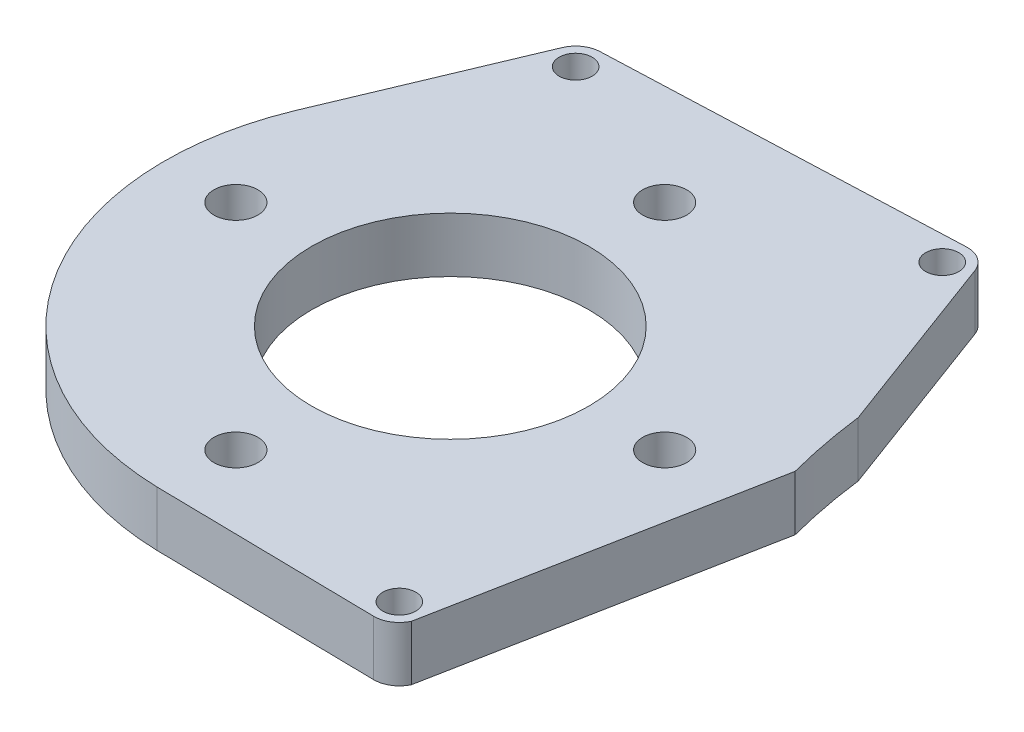
ISO-10303-21;
HEADER;
FILE_DESCRIPTION(('STEP AP214'),'2;1');
FILE_NAME('part.step','',(''),(''),'','','');
FILE_SCHEMA(('AUTOMOTIVE_DESIGN { 1 0 10303 214 1 1 1 1 }'));
ENDSEC;
DATA;
#1=APPLICATION_CONTEXT('core data for automotive mechanical design processes');
#2=APPLICATION_PROTOCOL_DEFINITION('international standard','automotive_design',2000,#1);
#3=PRODUCT_CONTEXT('',#1,'mechanical');
#4=PRODUCT('Part','Part','',(#3));
#5=PRODUCT_RELATED_PRODUCT_CATEGORY('part','',(#4));
#6=PRODUCT_DEFINITION_FORMATION('','',#4);
#7=PRODUCT_DEFINITION_CONTEXT('part definition',#1,'design');
#8=PRODUCT_DEFINITION('design','',#6,#7);
#9=PRODUCT_DEFINITION_SHAPE('','',#8);
#10=(LENGTH_UNIT() NAMED_UNIT(*) SI_UNIT(.MILLI.,.METRE.));
#11=(NAMED_UNIT(*) PLANE_ANGLE_UNIT() SI_UNIT($,.RADIAN.));
#12=(NAMED_UNIT(*) SI_UNIT($,.STERADIAN.) SOLID_ANGLE_UNIT());
#13=UNCERTAINTY_MEASURE_WITH_UNIT(LENGTH_MEASURE(1.E-05),#10,'distance_accuracy_value','');
#14=(GEOMETRIC_REPRESENTATION_CONTEXT(3) GLOBAL_UNCERTAINTY_ASSIGNED_CONTEXT((#13)) GLOBAL_UNIT_ASSIGNED_CONTEXT((#10,
#11,#12)) REPRESENTATION_CONTEXT('',''));
#15=CARTESIAN_POINT('',(0.,0.,0.));
#16=DIRECTION('',(0.,0.,1.));
#17=DIRECTION('',(1.,0.,0.));
#18=AXIS2_PLACEMENT_3D('',#15,#16,#17);
#19=CARTESIAN_POINT('',(-23.9831502007735,5.,-10.0655180305063));
#20=DIRECTION('',(-0.922083718984767,0.,-0.386990458775435));
#21=DIRECTION('',(-0.386990458775435,0.,0.922083718984767));
#22=AXIS2_PLACEMENT_3D('',#19,#20,#21);
#23=PLANE('',#22);
#24=DIRECTION('',(0.386990458775435,0.,-0.922083718984767));
#25=VECTOR('',#24,1.);
#26=CARTESIAN_POINT('',(-23.9831502007735,0.,-10.0655180305063));
#27=LINE('',#26,#25);
#28=CARTESIAN_POINT('',(-24.0506173641634,0.,-9.90476374957445));
#29=VERTEX_POINT('',#28);
#30=CARTESIAN_POINT('',(-16.8617701691663,0.,-27.0336588074826));
#31=VERTEX_POINT('',#30);
#32=EDGE_CURVE('E172',#29,#31,#27,.T.);
#33=ORIENTED_EDGE('',*,*,#32,.F.);
#34=DIRECTION('',(0.,-1.,0.));
#35=VECTOR('',#34,1.);
#36=CARTESIAN_POINT('',(-24.0506173641634,5.,-9.90476374957445));
#37=LINE('',#36,#35);
#38=CARTESIAN_POINT('',(-24.0506173641634,5.,-9.90476374957445));
#39=VERTEX_POINT('',#38);
#40=EDGE_CURVE('E11',#39,#29,#37,.T.);
#41=ORIENTED_EDGE('',*,*,#40,.F.);
#42=DIRECTION('',(0.386990458775435,0.,-0.922083718984767));
#43=VECTOR('',#42,1.);
#44=CARTESIAN_POINT('',(-23.9831502007735,5.,-10.0655180305063));
#45=LINE('',#44,#43);
#46=CARTESIAN_POINT('',(-16.8617701691663,5.,-27.0336588074826));
#47=VERTEX_POINT('',#46);
#48=EDGE_CURVE('E450',#39,#47,#45,.T.);
#49=ORIENTED_EDGE('',*,*,#48,.T.);
#50=DIRECTION('',(0.,-1.,0.));
#51=VECTOR('',#50,1.);
#52=CARTESIAN_POINT('',(-16.8617701691663,5.,-27.0336588074826));
#53=LINE('',#52,#51);
#54=EDGE_CURVE('E95',#47,#31,#53,.T.);
#55=ORIENTED_EDGE('',*,*,#54,.T.);
#56=EDGE_LOOP('',(#33,#41,#49,#55));
#57=FACE_BOUND('',#56,.T.);
#58=ADVANCED_FACE('F37',(#57),#23,.T.);
#59=CARTESIAN_POINT('',(0.,5.,0.));
#60=DIRECTION('',(0.,-1.,0.));
#61=DIRECTION('',(0.,0.,-1.));
#62=AXIS2_PLACEMENT_3D('',#59,#60,#61);
#63=CYLINDRICAL_SURFACE('',#62,26.0103160406075);
#64=CARTESIAN_POINT('',(0.,0.,0.));
#65=DIRECTION('',(0.,1.,0.));
#66=DIRECTION('',(0.,0.,1.));
#67=AXIS2_PLACEMENT_3D('',#64,#65,#66);
#68=CIRCLE('',#67,26.0103160406075);
#69=CARTESIAN_POINT('',(-0.695602201349699,0.,26.0010130208375));
#70=VERTEX_POINT('',#69);
#71=EDGE_CURVE('E174',#29,#70,#68,.T.);
#72=ORIENTED_EDGE('',*,*,#71,.T.);
#73=DIRECTION('',(0.,-1.,0.));
#74=VECTOR('',#73,1.);
#75=CARTESIAN_POINT('',(-0.695602201349699,5.,26.0010130208375));
#76=LINE('',#75,#74);
#77=CARTESIAN_POINT('',(-0.695602201349699,5.,26.0010130208375));
#78=VERTEX_POINT('',#77);
#79=EDGE_CURVE('E46',#78,#70,#76,.T.);
#80=ORIENTED_EDGE('',*,*,#79,.F.);
#81=CARTESIAN_POINT('',(0.,5.,0.));
#82=DIRECTION('',(0.,1.,0.));
#83=DIRECTION('',(0.,0.,1.));
#84=AXIS2_PLACEMENT_3D('',#81,#82,#83);
#85=CIRCLE('',#84,26.0103160406075);
#86=EDGE_CURVE('E448',#39,#78,#85,.T.);
#87=ORIENTED_EDGE('',*,*,#86,.F.);
#88=ORIENTED_EDGE('',*,*,#40,.T.);
#89=EDGE_LOOP('',(#72,#80,#87,#88));
#90=FACE_BOUND('',#89,.T.);
#91=ADVANCED_FACE('F216',(#90),#63,.T.);
#92=CARTESIAN_POINT('',(-0.431052323344283,5.,26.0053980657911));
#93=DIRECTION('',(0.0165732175791101,0.,-0.999862654797685));
#94=DIRECTION('',(-0.999862654797685,0.,-0.0165732175791101));
#95=AXIS2_PLACEMENT_3D('',#92,#93,#94);
#96=PLANE('',#95);
#97=DIRECTION('',(0.999862654797685,0.,0.0165732175791101));
#98=VECTOR('',#97,1.);
#99=CARTESIAN_POINT('',(-0.431052323344283,0.,26.0053980657911));
#100=LINE('',#99,#98);
#101=CARTESIAN_POINT('',(19.3427423938152,0.,26.3331584843242));
#102=VERTEX_POINT('',#101);
#103=EDGE_CURVE('E177',#70,#102,#100,.T.);
#104=ORIENTED_EDGE('',*,*,#103,.T.);
#105=DIRECTION('',(0.,-1.,0.));
#106=VECTOR('',#105,1.);
#107=CARTESIAN_POINT('',(19.3427423938152,5.,26.3331584843242));
#108=LINE('',#107,#106);
#109=CARTESIAN_POINT('',(19.3427423938152,5.,26.3331584843242));
#110=VERTEX_POINT('',#109);
#111=EDGE_CURVE('E206',#110,#102,#108,.T.);
#112=ORIENTED_EDGE('',*,*,#111,.F.);
#113=DIRECTION('',(0.999862654797685,0.,0.0165732175791101));
#114=VECTOR('',#113,1.);
#115=CARTESIAN_POINT('',(-0.431052323344283,5.,26.0053980657911));
#116=LINE('',#115,#114);
#117=EDGE_CURVE('E212',#78,#110,#116,.T.);
#118=ORIENTED_EDGE('',*,*,#117,.F.);
#119=ORIENTED_EDGE('',*,*,#79,.T.);
#120=EDGE_LOOP('',(#104,#112,#118,#119));
#121=FACE_BOUND('',#120,.T.);
#122=ADVANCED_FACE('F210',(#121),#96,.F.);
#123=CARTESIAN_POINT('',(19.3811663691345,5.,24.0150390372569));
#124=DIRECTION('',(0.,-1.,0.));
#125=DIRECTION('',(0.,0.,-1.));
#126=AXIS2_PLACEMENT_3D('',#123,#124,#125);
#127=CYLINDRICAL_SURFACE('',#126,2.3184378733861);
#128=CARTESIAN_POINT('',(19.3811663691345,0.,24.0150390372569));
#129=DIRECTION('',(0.,1.,0.));
#130=DIRECTION('',(0.,0.,1.));
#131=AXIS2_PLACEMENT_3D('',#128,#129,#130);
#132=CIRCLE('',#131,2.3184378733861);
#133=CARTESIAN_POINT('',(21.4769909446724,0.,25.0063379434009));
#134=VERTEX_POINT('',#133);
#135=EDGE_CURVE('E180',#134,#102,#132,.F.);
#136=ORIENTED_EDGE('',*,*,#135,.F.);
#137=DIRECTION('',(0.,-1.,0.));
#138=VECTOR('',#137,1.);
#139=CARTESIAN_POINT('',(21.4769909446724,5.,25.0063379434009));
#140=LINE('',#139,#138);
#141=CARTESIAN_POINT('',(21.4769909446724,5.,25.0063379434009));
#142=VERTEX_POINT('',#141);
#143=EDGE_CURVE('E204',#142,#134,#140,.T.);
#144=ORIENTED_EDGE('',*,*,#143,.F.);
#145=CARTESIAN_POINT('',(19.3811663691345,5.,24.0150390372569));
#146=DIRECTION('',(0.,1.,0.));
#147=DIRECTION('',(0.,0.,1.));
#148=AXIS2_PLACEMENT_3D('',#145,#146,#147);
#149=CIRCLE('',#148,2.3184378733861);
#150=EDGE_CURVE('E443',#142,#110,#149,.F.);
#151=ORIENTED_EDGE('',*,*,#150,.T.);
#152=ORIENTED_EDGE('',*,*,#111,.T.);
#153=EDGE_LOOP('',(#136,#144,#151,#152));
#154=FACE_BOUND('',#153,.T.);
#155=ADVANCED_FACE('F308',(#154),#127,.T.);
#156=CARTESIAN_POINT('',(25.3538779643672,5.,4.88509087050502));
#157=DIRECTION('',(0.98193926527339,0.,0.189196404073532));
#158=DIRECTION('',(0.189196404073532,0.,-0.98193926527339));
#159=AXIS2_PLACEMENT_3D('',#156,#157,#158);
#160=PLANE('',#159);
#161=DIRECTION('',(-0.189196404073532,0.,0.98193926527339));
#162=VECTOR('',#161,1.);
#163=CARTESIAN_POINT('',(25.3538779643672,0.,4.88509087050502));
#164=LINE('',#163,#162);
#165=CARTESIAN_POINT('',(27.1151291070307,0.,-4.25589498204183));
#166=VERTEX_POINT('',#165);
#167=EDGE_CURVE('E183',#166,#134,#164,.T.);
#168=ORIENTED_EDGE('',*,*,#167,.F.);
#169=DIRECTION('',(0.,-1.,0.));
#170=VECTOR('',#169,1.);
#171=CARTESIAN_POINT('',(27.1151291070307,5.,-4.25589498204183));
#172=LINE('',#171,#170);
#173=CARTESIAN_POINT('',(27.1151291070307,5.,-4.25589498204183));
#174=VERTEX_POINT('',#173);
#175=EDGE_CURVE('E202',#174,#166,#172,.T.);
#176=ORIENTED_EDGE('',*,*,#175,.F.);
#177=DIRECTION('',(-0.189196404073532,0.,0.98193926527339));
#178=VECTOR('',#177,1.);
#179=CARTESIAN_POINT('',(25.3538779643672,5.,4.88509087050502));
#180=LINE('',#179,#178);
#181=EDGE_CURVE('E441',#174,#142,#180,.T.);
#182=ORIENTED_EDGE('',*,*,#181,.T.);
#183=ORIENTED_EDGE('',*,*,#143,.T.);
#184=EDGE_LOOP('',(#168,#176,#182,#183));
#185=FACE_BOUND('',#184,.T.);
#186=ADVANCED_FACE('F304',(#185),#160,.T.);
#187=CARTESIAN_POINT('',(79.3405513289001,5.,-17.9856172569951));
#188=DIRECTION('',(0.,-1.,0.));
#189=DIRECTION('',(0.,0.,-1.));
#190=AXIS2_PLACEMENT_3D('',#187,#188,#189);
#191=CYLINDRICAL_SURFACE('',#190,53.999999999999);
#192=CARTESIAN_POINT('',(79.3405513289001,0.,-17.9856172569951));
#193=DIRECTION('',(0.,1.,0.));
#194=DIRECTION('',(0.,0.,1.));
#195=AXIS2_PLACEMENT_3D('',#192,#193,#194);
#196=CIRCLE('',#195,53.999999999999);
#197=CARTESIAN_POINT('',(25.7488035555476,0.,-11.3580558202938));
#198=VERTEX_POINT('',#197);
#199=EDGE_CURVE('E186',#198,#166,#196,.T.);
#200=ORIENTED_EDGE('',*,*,#199,.F.);
#201=DIRECTION('',(0.,-1.,0.));
#202=VECTOR('',#201,1.);
#203=CARTESIAN_POINT('',(25.7488035555476,5.,-11.3580558202938));
#204=LINE('',#203,#202);
#205=CARTESIAN_POINT('',(25.7488035555476,5.,-11.3580558202938));
#206=VERTEX_POINT('',#205);
#207=EDGE_CURVE('E200',#206,#198,#204,.T.);
#208=ORIENTED_EDGE('',*,*,#207,.F.);
#209=CARTESIAN_POINT('',(79.3405513289001,5.,-17.9856172569951));
#210=DIRECTION('',(0.,1.,0.));
#211=DIRECTION('',(0.,0.,1.));
#212=AXIS2_PLACEMENT_3D('',#209,#210,#211);
#213=CIRCLE('',#212,53.999999999999);
#214=EDGE_CURVE('E143',#206,#174,#213,.T.);
#215=ORIENTED_EDGE('',*,*,#214,.T.);
#216=ORIENTED_EDGE('',*,*,#175,.T.);
#217=EDGE_LOOP('',(#200,#208,#215,#216));
#218=FACE_BOUND('',#217,.T.);
#219=ADVANCED_FACE('F300',(#218),#191,.F.);
#220=CARTESIAN_POINT('',(26.3345174603486,5.,-9.78108409594893));
#221=DIRECTION('',(-0.937428851756888,0.,0.348176891671118));
#222=DIRECTION('',(0.348176891671119,0.,0.937428851756889));
#223=AXIS2_PLACEMENT_3D('',#220,#221,#222);
#224=PLANE('',#223);
#225=DIRECTION('',(-0.348176891671118,0.,-0.937428851756888));
#226=VECTOR('',#225,1.);
#227=CARTESIAN_POINT('',(26.3345174603486,0.,-9.78108409594893));
#228=LINE('',#227,#226);
#229=CARTESIAN_POINT('',(19.4840791028024,0.,-28.2251529505006));
#230=VERTEX_POINT('',#229);
#231=EDGE_CURVE('E189',#198,#230,#228,.T.);
#232=ORIENTED_EDGE('',*,*,#231,.T.);
#233=DIRECTION('',(0.,-1.,0.));
#234=VECTOR('',#233,1.);
#235=CARTESIAN_POINT('',(19.4840791028024,5.,-28.2251529505006));
#236=LINE('',#235,#234);
#237=CARTESIAN_POINT('',(19.4840791028024,5.,-28.2251529505006));
#238=VERTEX_POINT('',#237);
#239=EDGE_CURVE('E130',#238,#230,#236,.T.);
#240=ORIENTED_EDGE('',*,*,#239,.F.);
#241=DIRECTION('',(-0.348176891671118,0.,-0.937428851756888));
#242=VECTOR('',#241,1.);
#243=CARTESIAN_POINT('',(26.3345174603486,5.,-9.78108409594893));
#244=LINE('',#243,#242);
#245=EDGE_CURVE('E140',#206,#238,#244,.T.);
#246=ORIENTED_EDGE('',*,*,#245,.F.);
#247=ORIENTED_EDGE('',*,*,#207,.T.);
#248=EDGE_LOOP('',(#232,#240,#246,#247));
#249=FACE_BOUND('',#248,.T.);
#250=ADVANCED_FACE('F297',(#249),#224,.F.);
#251=CARTESIAN_POINT('',(17.3262332385357,5.,-27.4236925897301));
#252=DIRECTION('',(0.,-1.,0.));
#253=DIRECTION('',(0.,0.,-1.));
#254=AXIS2_PLACEMENT_3D('',#251,#252,#253);
#255=CYLINDRICAL_SURFACE('',#254,2.30187694801858);
#256=CARTESIAN_POINT('',(17.3262332385357,0.,-27.4236925897301));
#257=DIRECTION('',(0.,1.,0.));
#258=DIRECTION('',(0.,0.,1.));
#259=AXIS2_PLACEMENT_3D('',#256,#257,#258);
#260=CIRCLE('',#259,2.30187694801858);
#261=CARTESIAN_POINT('',(17.3553488122882,0.,-29.725385394425));
#262=VERTEX_POINT('',#261);
#263=EDGE_CURVE('E127',#262,#230,#260,.F.);
#264=ORIENTED_EDGE('',*,*,#263,.F.);
#265=DIRECTION('',(0.,-1.,0.));
#266=VECTOR('',#265,1.);
#267=CARTESIAN_POINT('',(17.3553488122882,5.,-29.725385394425));
#268=LINE('',#267,#266);
#269=CARTESIAN_POINT('',(17.3553488122882,5.,-29.725385394425));
#270=VERTEX_POINT('',#269);
#271=EDGE_CURVE('E121',#270,#262,#268,.T.);
#272=ORIENTED_EDGE('',*,*,#271,.F.);
#273=CARTESIAN_POINT('',(17.3262332385357,5.,-27.4236925897301));
#274=DIRECTION('',(0.,1.,0.));
#275=DIRECTION('',(0.,0.,1.));
#276=AXIS2_PLACEMENT_3D('',#273,#274,#275);
#277=CIRCLE('',#276,2.30187694801858);
#278=EDGE_CURVE('E125',#270,#238,#277,.F.);
#279=ORIENTED_EDGE('',*,*,#278,.T.);
#280=ORIENTED_EDGE('',*,*,#239,.T.);
#281=EDGE_LOOP('',(#264,#272,#279,#280));
#282=FACE_BOUND('',#281,.T.);
#283=ADVANCED_FACE('F123',(#282),#255,.T.);
#284=CARTESIAN_POINT('',(-1.15659199147025,5.,-28.9867456471124));
#285=DIRECTION('',(0.0398689945136324,0.,0.999204915558602));
#286=DIRECTION('',(0.999204915558602,0.,-0.0398689945136324));
#287=AXIS2_PLACEMENT_3D('',#284,#285,#286);
#288=PLANE('',#287);
#289=DIRECTION('',(-0.999204915558602,0.,0.0398689945136324));
#290=VECTOR('',#289,1.);
#291=CARTESIAN_POINT('',(-1.15659199147025,0.,-28.9867456471124));
#292=LINE('',#291,#290);
#293=CARTESIAN_POINT('',(-14.8390375859961,0.,-28.4408062308354));
#294=VERTEX_POINT('',#293);
#295=EDGE_CURVE('E193',#262,#294,#292,.T.);
#296=ORIENTED_EDGE('',*,*,#295,.T.);
#297=DIRECTION('',(0.,-1.,0.));
#298=VECTOR('',#297,1.);
#299=CARTESIAN_POINT('',(-14.8390375859961,5.,-28.4408062308354));
#300=LINE('',#299,#298);
#301=CARTESIAN_POINT('',(-14.8390375859961,5.,-28.4408062308354));
#302=VERTEX_POINT('',#301);
#303=EDGE_CURVE('E131',#302,#294,#300,.T.);
#304=ORIENTED_EDGE('',*,*,#303,.F.);
#305=DIRECTION('',(-0.999204915558602,0.,0.0398689945136324));
#306=VECTOR('',#305,1.);
#307=CARTESIAN_POINT('',(-1.15659199147025,5.,-28.9867456471124));
#308=LINE('',#307,#306);
#309=EDGE_CURVE('E134',#270,#302,#308,.T.);
#310=ORIENTED_EDGE('',*,*,#309,.F.);
#311=ORIENTED_EDGE('',*,*,#271,.T.);
#312=EDGE_LOOP('',(#296,#304,#310,#311));
#313=FACE_BOUND('',#312,.T.);
#314=ADVANCED_FACE('F135',(#313),#288,.F.);
#315=CARTESIAN_POINT('',(-14.7420760542392,5.,-26.1440417574143));
#316=DIRECTION('',(0.,-1.,0.));
#317=DIRECTION('',(0.,0.,-1.));
#318=AXIS2_PLACEMENT_3D('',#315,#316,#317);
#319=CYLINDRICAL_SURFACE('',#318,1.49999999999987);
#320=CARTESIAN_POINT('',(-14.7420760542392,5.,-26.1440417574143));
#321=DIRECTION('',(0.,1.,0.));
#322=DIRECTION('',(0.,0.,1.));
#323=AXIS2_PLACEMENT_3D('',#320,#321,#322);
#324=CIRCLE('',#323,1.49999999999987);
#325=CARTESIAN_POINT('',(-14.7420760542392,5.,-24.6440417574144));
#326=VERTEX_POINT('',#325);
#327=EDGE_CURVE('E452',#326,#326,#324,.T.);
#328=ORIENTED_EDGE('',*,*,#327,.T.);
#329=EDGE_LOOP('',(#328));
#330=FACE_BOUND('',#329,.T.);
#331=CARTESIAN_POINT('',(-14.7420760542392,0.,-26.1440417574143));
#332=DIRECTION('',(0.,1.,0.));
#333=DIRECTION('',(0.,0.,1.));
#334=AXIS2_PLACEMENT_3D('',#331,#332,#333);
#335=CIRCLE('',#334,1.49999999999987);
#336=CARTESIAN_POINT('',(-14.7420760542392,0.,-24.6440417574144));
#337=VERTEX_POINT('',#336);
#338=EDGE_CURVE('E169',#337,#337,#335,.T.);
#339=ORIENTED_EDGE('',*,*,#338,.F.);
#340=EDGE_LOOP('',(#339));
#341=FACE_BOUND('',#340,.T.);
#342=ADVANCED_FACE('F226',(#330,#341),#319,.F.);
#343=CARTESIAN_POINT('',(17.3262332385357,5.,-27.4236925897301));
#344=DIRECTION('',(0.,-1.,0.));
#345=DIRECTION('',(0.,0.,-1.));
#346=AXIS2_PLACEMENT_3D('',#343,#344,#345);
#347=CYLINDRICAL_SURFACE('',#346,1.5);
#348=CARTESIAN_POINT('',(17.3262332385357,5.,-27.4236925897301));
#349=DIRECTION('',(0.,1.,0.));
#350=DIRECTION('',(0.,0.,1.));
#351=AXIS2_PLACEMENT_3D('',#348,#349,#350);
#352=CIRCLE('',#351,1.5);
#353=CARTESIAN_POINT('',(17.3262332385357,5.,-25.9236925897301));
#354=VERTEX_POINT('',#353);
#355=EDGE_CURVE('E455',#354,#354,#352,.T.);
#356=ORIENTED_EDGE('',*,*,#355,.T.);
#357=EDGE_LOOP('',(#356));
#358=FACE_BOUND('',#357,.T.);
#359=CARTESIAN_POINT('',(17.3262332385357,0.,-27.4236925897301));
#360=DIRECTION('',(0.,1.,0.));
#361=DIRECTION('',(0.,0.,1.));
#362=AXIS2_PLACEMENT_3D('',#359,#360,#361);
#363=CIRCLE('',#362,1.5);
#364=CARTESIAN_POINT('',(17.3262332385357,0.,-25.9236925897301));
#365=VERTEX_POINT('',#364);
#366=EDGE_CURVE('E166',#365,#365,#363,.T.);
#367=ORIENTED_EDGE('',*,*,#366,.F.);
#368=EDGE_LOOP('',(#367));
#369=FACE_BOUND('',#368,.T.);
#370=ADVANCED_FACE('F229',(#358,#369),#347,.F.);
#371=CARTESIAN_POINT('',(19.3811663691345,5.,24.0150390372569));
#372=DIRECTION('',(0.,-1.,0.));
#373=DIRECTION('',(0.,0.,-1.));
#374=AXIS2_PLACEMENT_3D('',#371,#372,#373);
#375=CYLINDRICAL_SURFACE('',#374,1.5);
#376=CARTESIAN_POINT('',(19.3811663691345,5.,24.0150390372569));
#377=DIRECTION('',(0.,1.,0.));
#378=DIRECTION('',(0.,0.,1.));
#379=AXIS2_PLACEMENT_3D('',#376,#377,#378);
#380=CIRCLE('',#379,1.5);
#381=CARTESIAN_POINT('',(19.3811663691345,5.,25.5150390372569));
#382=VERTEX_POINT('',#381);
#383=EDGE_CURVE('E458',#382,#382,#380,.T.);
#384=ORIENTED_EDGE('',*,*,#383,.T.);
#385=EDGE_LOOP('',(#384));
#386=FACE_BOUND('',#385,.T.);
#387=CARTESIAN_POINT('',(19.3811663691345,0.,24.0150390372569));
#388=DIRECTION('',(0.,1.,0.));
#389=DIRECTION('',(0.,0.,1.));
#390=AXIS2_PLACEMENT_3D('',#387,#388,#389);
#391=CIRCLE('',#390,1.5);
#392=CARTESIAN_POINT('',(19.3811663691345,0.,25.5150390372569));
#393=VERTEX_POINT('',#392);
#394=EDGE_CURVE('E163',#393,#393,#391,.T.);
#395=ORIENTED_EDGE('',*,*,#394,.F.);
#396=EDGE_LOOP('',(#395));
#397=FACE_BOUND('',#396,.T.);
#398=ADVANCED_FACE('F233',(#386,#397),#375,.F.);
#399=CARTESIAN_POINT('',(0.,5.,0.));
#400=DIRECTION('',(0.,-1.,0.));
#401=DIRECTION('',(0.,0.,-1.));
#402=AXIS2_PLACEMENT_3D('',#399,#400,#401);
#403=CYLINDRICAL_SURFACE('',#402,12.6);
#404=CARTESIAN_POINT('',(0.,5.,0.));
#405=DIRECTION('',(0.,1.,0.));
#406=DIRECTION('',(0.,0.,1.));
#407=AXIS2_PLACEMENT_3D('',#404,#405,#406);
#408=CIRCLE('',#407,12.6);
#409=CARTESIAN_POINT('',(0.,5.,12.6));
#410=VERTEX_POINT('',#409);
#411=EDGE_CURVE('E461',#410,#410,#408,.T.);
#412=ORIENTED_EDGE('',*,*,#411,.T.);
#413=EDGE_LOOP('',(#412));
#414=FACE_BOUND('',#413,.T.);
#415=CARTESIAN_POINT('',(0.,0.,0.));
#416=DIRECTION('',(0.,1.,0.));
#417=DIRECTION('',(0.,0.,1.));
#418=AXIS2_PLACEMENT_3D('',#415,#416,#417);
#419=CIRCLE('',#418,12.6);
#420=CARTESIAN_POINT('',(0.,0.,12.6));
#421=VERTEX_POINT('',#420);
#422=EDGE_CURVE('E160',#421,#421,#419,.T.);
#423=ORIENTED_EDGE('',*,*,#422,.F.);
#424=EDGE_LOOP('',(#423));
#425=FACE_BOUND('',#424,.T.);
#426=ADVANCED_FACE('F237',(#414,#425),#403,.F.);
#427=CARTESIAN_POINT('',(-19.4999999999994,5.,5.54223333892878E-13));
#428=DIRECTION('',(0.,-1.,0.));
#429=DIRECTION('',(0.,0.,-1.));
#430=AXIS2_PLACEMENT_3D('',#427,#428,#429);
#431=CYLINDRICAL_SURFACE('',#430,2.00000000000089);
#432=CARTESIAN_POINT('',(-19.4999999999994,5.,5.54223333892878E-13));
#433=DIRECTION('',(0.,1.,0.));
#434=DIRECTION('',(0.,0.,1.));
#435=AXIS2_PLACEMENT_3D('',#432,#433,#434);
#436=CIRCLE('',#435,2.00000000000089);
#437=CARTESIAN_POINT('',(-19.4999999999994,5.,2.00000000000144));
#438=VERTEX_POINT('',#437);
#439=EDGE_CURVE('E464',#438,#438,#436,.T.);
#440=ORIENTED_EDGE('',*,*,#439,.T.);
#441=EDGE_LOOP('',(#440));
#442=FACE_BOUND('',#441,.T.);
#443=CARTESIAN_POINT('',(-19.4999999999994,0.,5.54223333892878E-13));
#444=DIRECTION('',(0.,1.,0.));
#445=DIRECTION('',(0.,0.,1.));
#446=AXIS2_PLACEMENT_3D('',#443,#444,#445);
#447=CIRCLE('',#446,2.00000000000089);
#448=CARTESIAN_POINT('',(-19.4999999999994,0.,2.00000000000144));
#449=VERTEX_POINT('',#448);
#450=EDGE_CURVE('E157',#449,#449,#447,.T.);
#451=ORIENTED_EDGE('',*,*,#450,.F.);
#452=EDGE_LOOP('',(#451));
#453=FACE_BOUND('',#452,.T.);
#454=ADVANCED_FACE('F241',(#442,#453),#431,.F.);
#455=CARTESIAN_POINT('',(1.10367054526908E-12,5.,19.5));
#456=DIRECTION('',(0.,-1.,0.));
#457=DIRECTION('',(0.,0.,-1.));
#458=AXIS2_PLACEMENT_3D('',#455,#456,#457);
#459=CYLINDRICAL_SURFACE('',#458,2.00000000000119);
#460=CARTESIAN_POINT('',(1.10367054526908E-12,5.,19.5));
#461=DIRECTION('',(0.,1.,0.));
#462=DIRECTION('',(0.,0.,1.));
#463=AXIS2_PLACEMENT_3D('',#460,#461,#462);
#464=CIRCLE('',#463,2.00000000000119);
#465=CARTESIAN_POINT('',(1.10367054526908E-12,5.,21.5000000000012));
#466=VERTEX_POINT('',#465);
#467=EDGE_CURVE('E467',#466,#466,#464,.T.);
#468=ORIENTED_EDGE('',*,*,#467,.T.);
#469=EDGE_LOOP('',(#468));
#470=FACE_BOUND('',#469,.T.);
#471=CARTESIAN_POINT('',(1.10367054526908E-12,0.,19.5));
#472=DIRECTION('',(0.,1.,0.));
#473=DIRECTION('',(0.,0.,1.));
#474=AXIS2_PLACEMENT_3D('',#471,#472,#473);
#475=CIRCLE('',#474,2.00000000000119);
#476=CARTESIAN_POINT('',(1.10367054526908E-12,0.,21.5000000000012));
#477=VERTEX_POINT('',#476);
#478=EDGE_CURVE('E154',#477,#477,#475,.T.);
#479=ORIENTED_EDGE('',*,*,#478,.F.);
#480=EDGE_LOOP('',(#479));
#481=FACE_BOUND('',#480,.T.);
#482=ADVANCED_FACE('F245',(#470,#481),#459,.F.);
#483=CARTESIAN_POINT('',(19.5000000000005,5.,-5.51835272634541E-13));
#484=DIRECTION('',(0.,-1.,0.));
#485=DIRECTION('',(0.,0.,-1.));
#486=AXIS2_PLACEMENT_3D('',#483,#484,#485);
#487=CYLINDRICAL_SURFACE('',#486,2.00000000000043);
#488=CARTESIAN_POINT('',(19.5000000000005,5.,-5.51835272634541E-13));
#489=DIRECTION('',(0.,1.,0.));
#490=DIRECTION('',(0.,0.,1.));
#491=AXIS2_PLACEMENT_3D('',#488,#489,#490);
#492=CIRCLE('',#491,2.00000000000043);
#493=CARTESIAN_POINT('',(19.5000000000005,5.,1.99999999999988));
#494=VERTEX_POINT('',#493);
#495=EDGE_CURVE('E260',#494,#494,#492,.T.);
#496=ORIENTED_EDGE('',*,*,#495,.T.);
#497=EDGE_LOOP('',(#496));
#498=FACE_BOUND('',#497,.T.);
#499=CARTESIAN_POINT('',(19.5000000000005,0.,-5.51835272634541E-13));
#500=DIRECTION('',(0.,1.,0.));
#501=DIRECTION('',(0.,0.,1.));
#502=AXIS2_PLACEMENT_3D('',#499,#500,#501);
#503=CIRCLE('',#502,2.00000000000043);
#504=CARTESIAN_POINT('',(19.5000000000005,0.,1.99999999999988));
#505=VERTEX_POINT('',#504);
#506=EDGE_CURVE('E151',#505,#505,#503,.T.);
#507=ORIENTED_EDGE('',*,*,#506,.F.);
#508=EDGE_LOOP('',(#507));
#509=FACE_BOUND('',#508,.T.);
#510=ADVANCED_FACE('F248',(#498,#509),#487,.F.);
#511=CARTESIAN_POINT('',(0.,5.,-19.5));
#512=DIRECTION('',(0.,-1.,0.));
#513=DIRECTION('',(0.,0.,-1.));
#514=AXIS2_PLACEMENT_3D('',#511,#512,#513);
#515=CYLINDRICAL_SURFACE('',#514,2.);
#516=CARTESIAN_POINT('',(0.,5.,-19.5));
#517=DIRECTION('',(0.,1.,0.));
#518=DIRECTION('',(0.,0.,1.));
#519=AXIS2_PLACEMENT_3D('',#516,#517,#518);
#520=CIRCLE('',#519,2.);
#521=CARTESIAN_POINT('',(0.,5.,-17.5));
#522=VERTEX_POINT('',#521);
#523=EDGE_CURVE('E196',#522,#522,#520,.T.);
#524=ORIENTED_EDGE('',*,*,#523,.T.);
#525=EDGE_LOOP('',(#524));
#526=FACE_BOUND('',#525,.T.);
#527=CARTESIAN_POINT('',(0.,0.,-19.5));
#528=DIRECTION('',(0.,1.,0.));
#529=DIRECTION('',(0.,0.,1.));
#530=AXIS2_PLACEMENT_3D('',#527,#528,#529);
#531=CIRCLE('',#530,2.);
#532=CARTESIAN_POINT('',(0.,0.,-17.5));
#533=VERTEX_POINT('',#532);
#534=EDGE_CURVE('E148',#533,#533,#531,.T.);
#535=ORIENTED_EDGE('',*,*,#534,.F.);
#536=EDGE_LOOP('',(#535));
#537=FACE_BOUND('',#536,.T.);
#538=ADVANCED_FACE('F39',(#526,#537),#515,.F.);
#539=CARTESIAN_POINT('',(-14.7420760542392,5.,-26.1440417574143));
#540=DIRECTION('',(0.,-1.,0.));
#541=DIRECTION('',(0.,0.,-1.));
#542=AXIS2_PLACEMENT_3D('',#539,#540,#541);
#543=CYLINDRICAL_SURFACE('',#542,2.2988094985924);
#544=CARTESIAN_POINT('',(-14.7420760542392,0.,-26.1440417574143));
#545=DIRECTION('',(0.,1.,0.));
#546=DIRECTION('',(0.,0.,1.));
#547=AXIS2_PLACEMENT_3D('',#544,#545,#546);
#548=CIRCLE('',#547,2.2988094985924);
#549=EDGE_CURVE('E88',#294,#31,#548,.T.);
#550=ORIENTED_EDGE('',*,*,#549,.T.);
#551=ORIENTED_EDGE('',*,*,#54,.F.);
#552=CARTESIAN_POINT('',(-14.7420760542392,5.,-26.1440417574143));
#553=DIRECTION('',(0.,1.,0.));
#554=DIRECTION('',(0.,0.,1.));
#555=AXIS2_PLACEMENT_3D('',#552,#553,#554);
#556=CIRCLE('',#555,2.2988094985924);
#557=EDGE_CURVE('E54',#302,#47,#556,.T.);
#558=ORIENTED_EDGE('',*,*,#557,.F.);
#559=ORIENTED_EDGE('',*,*,#303,.T.);
#560=EDGE_LOOP('',(#550,#551,#558,#559));
#561=FACE_BOUND('',#560,.T.);
#562=ADVANCED_FACE('F255',(#561),#543,.T.);
#563=CARTESIAN_POINT('',(0.,5.,0.));
#564=DIRECTION('',(0.,1.,0.));
#565=DIRECTION('',(0.,0.,1.));
#566=AXIS2_PLACEMENT_3D('',#563,#564,#565);
#567=PLANE('',#566);
#568=ORIENTED_EDGE('',*,*,#523,.F.);
#569=EDGE_LOOP('',(#568));
#570=FACE_BOUND('',#569,.T.);
#571=ORIENTED_EDGE('',*,*,#495,.F.);
#572=EDGE_LOOP('',(#571));
#573=FACE_BOUND('',#572,.T.);
#574=ORIENTED_EDGE('',*,*,#467,.F.);
#575=EDGE_LOOP('',(#574));
#576=FACE_BOUND('',#575,.T.);
#577=ORIENTED_EDGE('',*,*,#439,.F.);
#578=EDGE_LOOP('',(#577));
#579=FACE_BOUND('',#578,.T.);
#580=ORIENTED_EDGE('',*,*,#411,.F.);
#581=EDGE_LOOP('',(#580));
#582=FACE_BOUND('',#581,.T.);
#583=ORIENTED_EDGE('',*,*,#383,.F.);
#584=EDGE_LOOP('',(#583));
#585=FACE_BOUND('',#584,.T.);
#586=ORIENTED_EDGE('',*,*,#355,.F.);
#587=EDGE_LOOP('',(#586));
#588=FACE_BOUND('',#587,.T.);
#589=ORIENTED_EDGE('',*,*,#327,.F.);
#590=EDGE_LOOP('',(#589));
#591=FACE_BOUND('',#590,.T.);
#592=ORIENTED_EDGE('',*,*,#48,.F.);
#593=ORIENTED_EDGE('',*,*,#86,.T.);
#594=ORIENTED_EDGE('',*,*,#117,.T.);
#595=ORIENTED_EDGE('',*,*,#150,.F.);
#596=ORIENTED_EDGE('',*,*,#181,.F.);
#597=ORIENTED_EDGE('',*,*,#214,.F.);
#598=ORIENTED_EDGE('',*,*,#245,.T.);
#599=ORIENTED_EDGE('',*,*,#278,.F.);
#600=ORIENTED_EDGE('',*,*,#309,.T.);
#601=ORIENTED_EDGE('',*,*,#557,.T.);
#602=EDGE_LOOP('',(#592,#593,#594,#595,#596,#597,#598,#599,#600,#601));
#603=FACE_BOUND('',#602,.T.);
#604=ADVANCED_FACE('F137',(#570,#573,#576,#579,#582,#585,#588,#591,#603),#567,.T.);
#605=CARTESIAN_POINT('',(0.,0.,0.));
#606=DIRECTION('',(0.,1.,0.));
#607=DIRECTION('',(0.,0.,1.));
#608=AXIS2_PLACEMENT_3D('',#605,#606,#607);
#609=PLANE('',#608);
#610=ORIENTED_EDGE('',*,*,#534,.T.);
#611=EDGE_LOOP('',(#610));
#612=FACE_BOUND('',#611,.T.);
#613=ORIENTED_EDGE('',*,*,#506,.T.);
#614=EDGE_LOOP('',(#613));
#615=FACE_BOUND('',#614,.T.);
#616=ORIENTED_EDGE('',*,*,#478,.T.);
#617=EDGE_LOOP('',(#616));
#618=FACE_BOUND('',#617,.T.);
#619=ORIENTED_EDGE('',*,*,#450,.T.);
#620=EDGE_LOOP('',(#619));
#621=FACE_BOUND('',#620,.T.);
#622=ORIENTED_EDGE('',*,*,#422,.T.);
#623=EDGE_LOOP('',(#622));
#624=FACE_BOUND('',#623,.T.);
#625=ORIENTED_EDGE('',*,*,#394,.T.);
#626=EDGE_LOOP('',(#625));
#627=FACE_BOUND('',#626,.T.);
#628=ORIENTED_EDGE('',*,*,#366,.T.);
#629=EDGE_LOOP('',(#628));
#630=FACE_BOUND('',#629,.T.);
#631=ORIENTED_EDGE('',*,*,#338,.T.);
#632=EDGE_LOOP('',(#631));
#633=FACE_BOUND('',#632,.T.);
#634=ORIENTED_EDGE('',*,*,#32,.T.);
#635=ORIENTED_EDGE('',*,*,#549,.F.);
#636=ORIENTED_EDGE('',*,*,#295,.F.);
#637=ORIENTED_EDGE('',*,*,#263,.T.);
#638=ORIENTED_EDGE('',*,*,#231,.F.);
#639=ORIENTED_EDGE('',*,*,#199,.T.);
#640=ORIENTED_EDGE('',*,*,#167,.T.);
#641=ORIENTED_EDGE('',*,*,#135,.T.);
#642=ORIENTED_EDGE('',*,*,#103,.F.);
#643=ORIENTED_EDGE('',*,*,#71,.F.);
#644=EDGE_LOOP('',(#634,#635,#636,#637,#638,#639,#640,#641,#642,#643));
#645=FACE_BOUND('',#644,.T.);
#646=ADVANCED_FACE('F217',(#612,#615,#618,#621,#624,#627,#630,#633,#645),#609,.F.);
#647=CLOSED_SHELL('',(#58,#91,#122,#155,#186,#219,#250,#283,#314,#342,#370,#398,#426,#454,#482,
#510,#538,#562,#604,#646));
#648=MANIFOLD_SOLID_BREP('B2',#647);
#649=ADVANCED_BREP_SHAPE_REPRESENTATION('',(#18,#648),#14);
#650=SHAPE_DEFINITION_REPRESENTATION(#9,#649);
ENDSEC;
END-ISO-10303-21;
